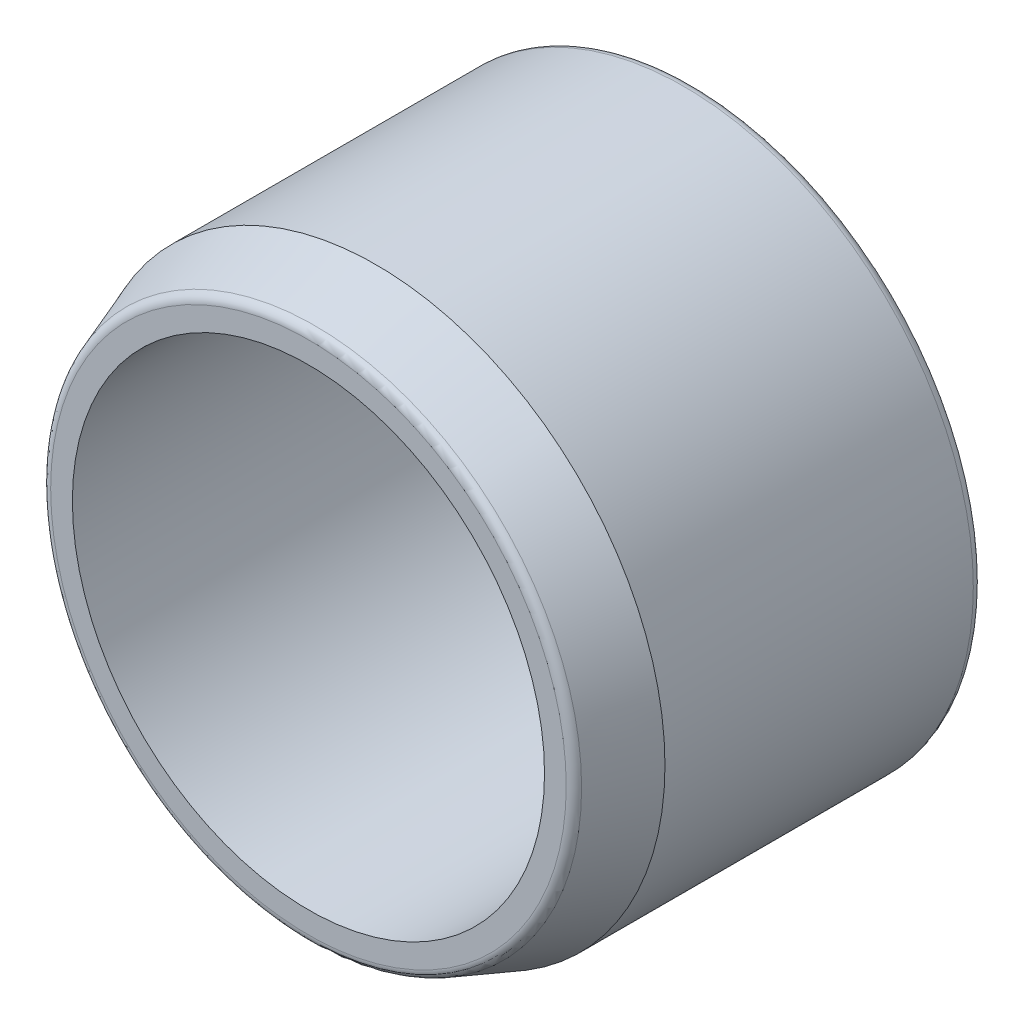
ISO-10303-21;
HEADER;
FILE_DESCRIPTION(('STEP AP214'),'2;1');
FILE_NAME('part.step','',(''),(''),'','','');
FILE_SCHEMA(('AUTOMOTIVE_DESIGN { 1 0 10303 214 1 1 1 1 }'));
ENDSEC;
DATA;
#1=APPLICATION_CONTEXT('core data for automotive mechanical design processes');
#2=APPLICATION_PROTOCOL_DEFINITION('international standard','automotive_design',2000,#1);
#3=PRODUCT_CONTEXT('',#1,'mechanical');
#4=PRODUCT('Part','Part','',(#3));
#5=PRODUCT_RELATED_PRODUCT_CATEGORY('part','',(#4));
#6=PRODUCT_DEFINITION_FORMATION('','',#4);
#7=PRODUCT_DEFINITION_CONTEXT('part definition',#1,'design');
#8=PRODUCT_DEFINITION('design','',#6,#7);
#9=PRODUCT_DEFINITION_SHAPE('','',#8);
#10=(LENGTH_UNIT() NAMED_UNIT(*) SI_UNIT(.MILLI.,.METRE.));
#11=(NAMED_UNIT(*) PLANE_ANGLE_UNIT() SI_UNIT($,.RADIAN.));
#12=(NAMED_UNIT(*) SI_UNIT($,.STERADIAN.) SOLID_ANGLE_UNIT());
#13=UNCERTAINTY_MEASURE_WITH_UNIT(LENGTH_MEASURE(1.E-05),#10,'distance_accuracy_value','');
#14=(GEOMETRIC_REPRESENTATION_CONTEXT(3) GLOBAL_UNCERTAINTY_ASSIGNED_CONTEXT((#13)) GLOBAL_UNIT_ASSIGNED_CONTEXT((#10,
#11,#12)) REPRESENTATION_CONTEXT('',''));
#15=CARTESIAN_POINT('',(0.,0.,0.));
#16=DIRECTION('',(0.,0.,1.));
#17=DIRECTION('',(1.,0.,0.));
#18=AXIS2_PLACEMENT_3D('',#15,#16,#17);
#19=CARTESIAN_POINT('',(0.,0.,40.));
#20=DIRECTION('',(0.,0.,1.));
#21=DIRECTION('',(1.,0.,0.));
#22=AXIS2_PLACEMENT_3D('',#19,#20,#21);
#23=PLANE('',#22);
#24=CARTESIAN_POINT('',(0.,0.,40.));
#25=DIRECTION('',(0.,0.,1.));
#26=DIRECTION('',(1.,0.,0.));
#27=AXIS2_PLACEMENT_3D('',#24,#25,#26);
#28=CIRCLE('',#27,26.7520008219269);
#29=CARTESIAN_POINT('',(26.7520008219269,0.,40.));
#30=VERTEX_POINT('',#29);
#31=EDGE_CURVE('E49',#30,#30,#28,.T.);
#32=ORIENTED_EDGE('',*,*,#31,.T.);
#33=EDGE_LOOP('',(#32));
#34=FACE_BOUND('',#33,.T.);
#35=CARTESIAN_POINT('',(0.,0.,40.));
#36=DIRECTION('',(0.,0.,1.));
#37=DIRECTION('',(1.,0.,0.));
#38=AXIS2_PLACEMENT_3D('',#35,#36,#37);
#39=CIRCLE('',#38,24.5);
#40=CARTESIAN_POINT('',(24.5,0.,40.));
#41=VERTEX_POINT('',#40);
#42=EDGE_CURVE('E69',#41,#41,#39,.T.);
#43=ORIENTED_EDGE('',*,*,#42,.F.);
#44=EDGE_LOOP('',(#43));
#45=FACE_BOUND('',#44,.T.);
#46=ADVANCED_FACE('F41',(#34,#45),#23,.T.);
#47=CARTESIAN_POINT('',(0.,0.,0.));
#48=DIRECTION('',(0.,0.,1.));
#49=DIRECTION('',(1.,0.,0.));
#50=AXIS2_PLACEMENT_3D('',#47,#48,#49);
#51=PLANE('',#50);
#52=CARTESIAN_POINT('',(0.,0.,0.));
#53=DIRECTION('',(0.,0.,1.));
#54=DIRECTION('',(1.,0.,0.));
#55=AXIS2_PLACEMENT_3D('',#52,#53,#54);
#56=CIRCLE('',#55,29.);
#57=CARTESIAN_POINT('',(29.,0.,0.));
#58=VERTEX_POINT('',#57);
#59=EDGE_CURVE('E54',#58,#58,#56,.F.);
#60=ORIENTED_EDGE('',*,*,#59,.T.);
#61=EDGE_LOOP('',(#60));
#62=FACE_BOUND('',#61,.T.);
#63=CARTESIAN_POINT('',(0.,0.,0.));
#64=DIRECTION('',(0.,0.,1.));
#65=DIRECTION('',(1.,0.,0.));
#66=AXIS2_PLACEMENT_3D('',#63,#64,#65);
#67=CIRCLE('',#66,24.5);
#68=CARTESIAN_POINT('',(24.5,0.,0.));
#69=VERTEX_POINT('',#68);
#70=EDGE_CURVE('E70',#69,#69,#67,.T.);
#71=ORIENTED_EDGE('',*,*,#70,.T.);
#72=EDGE_LOOP('',(#71));
#73=FACE_BOUND('',#72,.T.);
#74=ADVANCED_FACE('F82',(#62,#73),#51,.F.);
#75=CARTESIAN_POINT('',(0.,0.,40.));
#76=DIRECTION('',(0.,0.,-1.));
#77=DIRECTION('',(-1.,0.,0.));
#78=AXIS2_PLACEMENT_3D('',#75,#76,#77);
#79=CYLINDRICAL_SURFACE('',#78,30.);
#80=CARTESIAN_POINT('',(0.,0.,1.));
#81=DIRECTION('',(0.,0.,1.));
#82=DIRECTION('',(1.,0.,0.));
#83=AXIS2_PLACEMENT_3D('',#80,#81,#82);
#84=CIRCLE('',#83,30.);
#85=CARTESIAN_POINT('',(30.,0.,1.));
#86=VERTEX_POINT('',#85);
#87=EDGE_CURVE('E59',#86,#86,#84,.T.);
#88=ORIENTED_EDGE('',*,*,#87,.T.);
#89=EDGE_LOOP('',(#88));
#90=FACE_BOUND('',#89,.T.);
#91=CARTESIAN_POINT('',(0.,0.,32.9999999999999));
#92=DIRECTION('',(0.,0.,1.));
#93=DIRECTION('',(1.,0.,0.));
#94=AXIS2_PLACEMENT_3D('',#91,#92,#93);
#95=CIRCLE('',#94,30.);
#96=CARTESIAN_POINT('',(30.,0.,32.9999999999999));
#97=VERTEX_POINT('',#96);
#98=EDGE_CURVE('E65',#97,#97,#95,.F.);
#99=ORIENTED_EDGE('',*,*,#98,.T.);
#100=EDGE_LOOP('',(#99));
#101=FACE_BOUND('',#100,.T.);
#102=ADVANCED_FACE('F87',(#90,#101),#79,.T.);
#103=CARTESIAN_POINT('',(0.,0.,40.));
#104=DIRECTION('',(0.,0.,-1.));
#105=DIRECTION('',(-1.,0.,0.));
#106=AXIS2_PLACEMENT_3D('',#103,#104,#105);
#107=CYLINDRICAL_SURFACE('',#106,24.5);
#108=ORIENTED_EDGE('',*,*,#42,.T.);
#109=EDGE_LOOP('',(#108));
#110=FACE_BOUND('',#109,.T.);
#111=ORIENTED_EDGE('',*,*,#70,.F.);
#112=EDGE_LOOP('',(#111));
#113=FACE_BOUND('',#112,.T.);
#114=ADVANCED_FACE('F78',(#110,#113),#107,.F.);
#115=CARTESIAN_POINT('',(0.,0.,40.));
#116=DIRECTION('',(0.,0.,-1.));
#117=DIRECTION('',(-1.,0.,0.));
#118=AXIS2_PLACEMENT_3D('',#115,#116,#117);
#119=CONICAL_SURFACE('',#118,27.4522083601366,0.349065850398863);
#120=CARTESIAN_POINT('',(0.,0.,39.3420201433257));
#121=DIRECTION('',(0.,0.,1.));
#122=DIRECTION('',(1.,0.,0.));
#123=AXIS2_PLACEMENT_3D('',#120,#121,#122);
#124=CIRCLE('',#123,27.6916934427128);
#125=CARTESIAN_POINT('',(27.6916934427128,0.,39.3420201433257));
#126=VERTEX_POINT('',#125);
#127=EDGE_CURVE('E10',#126,#126,#124,.F.);
#128=ORIENTED_EDGE('',*,*,#127,.T.);
#129=EDGE_LOOP('',(#128));
#130=FACE_BOUND('',#129,.T.);
#131=ORIENTED_EDGE('',*,*,#98,.F.);
#132=EDGE_LOOP('',(#131));
#133=FACE_BOUND('',#132,.T.);
#134=ADVANCED_FACE('F96',(#130,#133),#119,.T.);
#135=CARTESIAN_POINT('',(0.,0.,1.));
#136=DIRECTION('',(0.,0.,1.));
#137=DIRECTION('',(1.,0.,0.));
#138=AXIS2_PLACEMENT_3D('',#135,#136,#137);
#139=TOROIDAL_SURFACE('',#138,29.,1.);
#140=ORIENTED_EDGE('',*,*,#59,.F.);
#141=EDGE_LOOP('',(#140));
#142=FACE_BOUND('',#141,.T.);
#143=ORIENTED_EDGE('',*,*,#87,.F.);
#144=EDGE_LOOP('',(#143));
#145=FACE_BOUND('',#144,.T.);
#146=ADVANCED_FACE('F100',(#142,#145),#139,.T.);
#147=CARTESIAN_POINT('',(0.,0.,39.));
#148=DIRECTION('',(0.,0.,1.));
#149=DIRECTION('',(1.,0.,0.));
#150=AXIS2_PLACEMENT_3D('',#147,#148,#149);
#151=TOROIDAL_SURFACE('',#150,26.7520008219269,1.);
#152=ORIENTED_EDGE('',*,*,#127,.F.);
#153=EDGE_LOOP('',(#152));
#154=FACE_BOUND('',#153,.T.);
#155=ORIENTED_EDGE('',*,*,#31,.F.);
#156=EDGE_LOOP('',(#155));
#157=FACE_BOUND('',#156,.T.);
#158=ADVANCED_FACE('F43',(#154,#157),#151,.T.);
#159=CLOSED_SHELL('',(#46,#74,#102,#114,#134,#146,#158));
#160=MANIFOLD_SOLID_BREP('B2',#159);
#161=ADVANCED_BREP_SHAPE_REPRESENTATION('',(#18,#160),#14);
#162=SHAPE_DEFINITION_REPRESENTATION(#9,#161);
ENDSEC;
END-ISO-10303-21;
